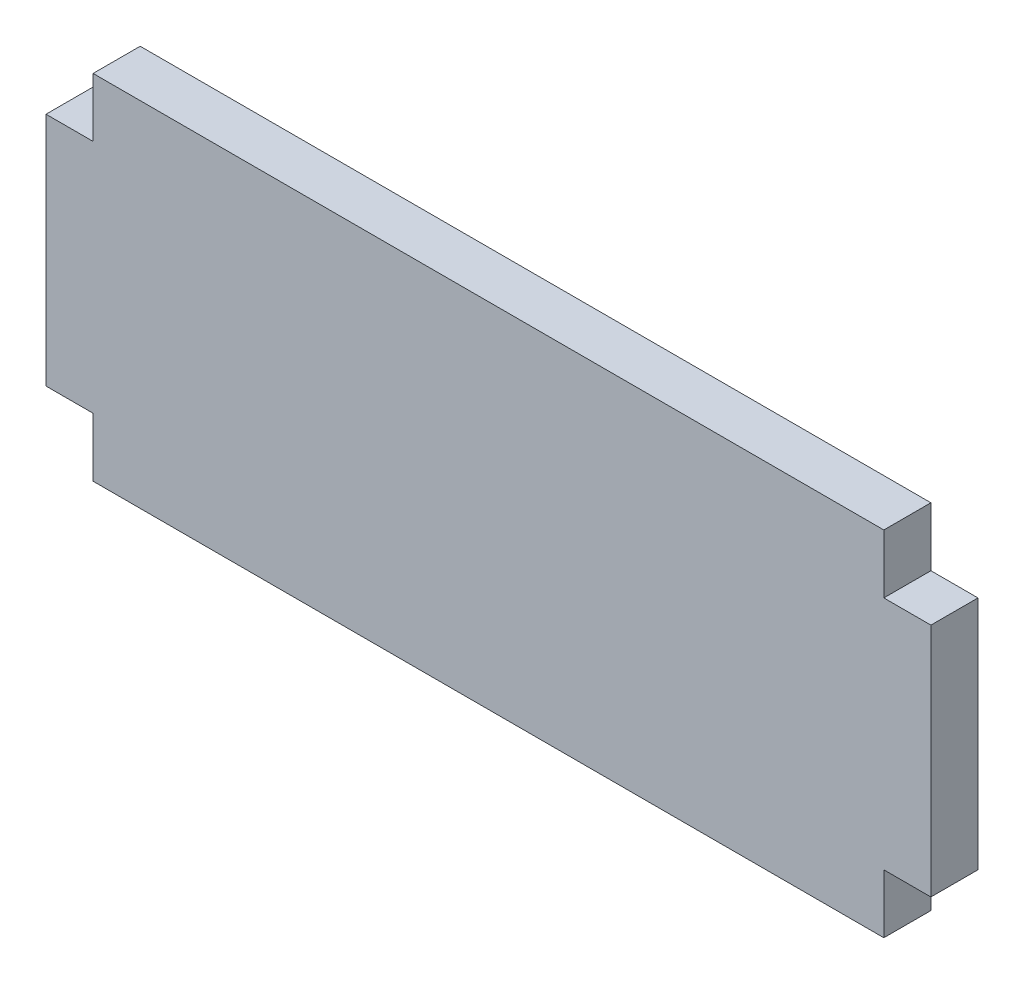
ISO-10303-21;
HEADER;
FILE_DESCRIPTION(('STEP AP214'),'2;1');
FILE_NAME('part.step','',(''),(''),'','','');
FILE_SCHEMA(('AUTOMOTIVE_DESIGN { 1 0 10303 214 1 1 1 1 }'));
ENDSEC;
DATA;
#1=APPLICATION_CONTEXT('core data for automotive mechanical design processes');
#2=APPLICATION_PROTOCOL_DEFINITION('international standard','automotive_design',2000,#1);
#3=PRODUCT_CONTEXT('',#1,'mechanical');
#4=PRODUCT('Part','Part','',(#3));
#5=PRODUCT_RELATED_PRODUCT_CATEGORY('part','',(#4));
#6=PRODUCT_DEFINITION_FORMATION('','',#4);
#7=PRODUCT_DEFINITION_CONTEXT('part definition',#1,'design');
#8=PRODUCT_DEFINITION('design','',#6,#7);
#9=PRODUCT_DEFINITION_SHAPE('','',#8);
#10=(LENGTH_UNIT() NAMED_UNIT(*) SI_UNIT(.MILLI.,.METRE.));
#11=(NAMED_UNIT(*) PLANE_ANGLE_UNIT() SI_UNIT($,.RADIAN.));
#12=(NAMED_UNIT(*) SI_UNIT($,.STERADIAN.) SOLID_ANGLE_UNIT());
#13=UNCERTAINTY_MEASURE_WITH_UNIT(LENGTH_MEASURE(1.E-05),#10,'distance_accuracy_value','');
#14=(GEOMETRIC_REPRESENTATION_CONTEXT(3) GLOBAL_UNCERTAINTY_ASSIGNED_CONTEXT((#13)) GLOBAL_UNIT_ASSIGNED_CONTEXT((#10,
#11,#12)) REPRESENTATION_CONTEXT('',''));
#15=CARTESIAN_POINT('',(0.,0.,0.));
#16=DIRECTION('',(0.,0.,1.));
#17=DIRECTION('',(1.,0.,0.));
#18=AXIS2_PLACEMENT_3D('',#15,#16,#17);
#19=CARTESIAN_POINT('',(0.,-6.,2.4));
#20=DIRECTION('',(0.,-1.,0.));
#21=DIRECTION('',(0.,0.,-1.));
#22=AXIS2_PLACEMENT_3D('',#19,#20,#21);
#23=PLANE('',#22);
#24=DIRECTION('',(-1.,0.,0.));
#25=VECTOR('',#24,1.);
#26=CARTESIAN_POINT('',(0.,-6.,0.));
#27=LINE('',#26,#25);
#28=CARTESIAN_POINT('',(-20.15,-6.,0.));
#29=VERTEX_POINT('',#28);
#30=CARTESIAN_POINT('',(-22.55,-6.,0.));
#31=VERTEX_POINT('',#30);
#32=EDGE_CURVE('E154',#29,#31,#27,.T.);
#33=ORIENTED_EDGE('',*,*,#32,.F.);
#34=DIRECTION('',(0.,0.,-1.));
#35=VECTOR('',#34,1.);
#36=CARTESIAN_POINT('',(-20.15,-6.,2.4));
#37=LINE('',#36,#35);
#38=CARTESIAN_POINT('',(-20.15,-6.,2.4));
#39=VERTEX_POINT('',#38);
#40=EDGE_CURVE('E11',#39,#29,#37,.T.);
#41=ORIENTED_EDGE('',*,*,#40,.F.);
#42=DIRECTION('',(-1.,0.,0.));
#43=VECTOR('',#42,1.);
#44=CARTESIAN_POINT('',(0.,-6.,2.4));
#45=LINE('',#44,#43);
#46=CARTESIAN_POINT('',(-22.55,-6.,2.4));
#47=VERTEX_POINT('',#46);
#48=EDGE_CURVE('E181',#39,#47,#45,.T.);
#49=ORIENTED_EDGE('',*,*,#48,.T.);
#50=DIRECTION('',(0.,0.,-1.));
#51=VECTOR('',#50,1.);
#52=CARTESIAN_POINT('',(-22.55,-6.,2.4));
#53=LINE('',#52,#51);
#54=EDGE_CURVE('E97',#47,#31,#53,.T.);
#55=ORIENTED_EDGE('',*,*,#54,.T.);
#56=EDGE_LOOP('',(#33,#41,#49,#55));
#57=FACE_BOUND('',#56,.T.);
#58=ADVANCED_FACE('F34',(#57),#23,.T.);
#59=CARTESIAN_POINT('',(-20.15,0.,2.4));
#60=DIRECTION('',(1.,0.,0.));
#61=DIRECTION('',(0.,1.,0.));
#62=AXIS2_PLACEMENT_3D('',#59,#60,#61);
#63=PLANE('',#62);
#64=DIRECTION('',(0.,-1.,0.));
#65=VECTOR('',#64,1.);
#66=CARTESIAN_POINT('',(-20.15,0.,0.));
#67=LINE('',#66,#65);
#68=CARTESIAN_POINT('',(-20.15,-8.99999999999999,0.));
#69=VERTEX_POINT('',#68);
#70=EDGE_CURVE('E157',#29,#69,#67,.T.);
#71=ORIENTED_EDGE('',*,*,#70,.T.);
#72=DIRECTION('',(0.,0.,-1.));
#73=VECTOR('',#72,1.);
#74=CARTESIAN_POINT('',(-20.15,-8.99999999999999,2.4));
#75=LINE('',#74,#73);
#76=CARTESIAN_POINT('',(-20.15,-8.99999999999999,2.4));
#77=VERTEX_POINT('',#76);
#78=EDGE_CURVE('E42',#77,#69,#75,.T.);
#79=ORIENTED_EDGE('',*,*,#78,.F.);
#80=DIRECTION('',(0.,-1.,0.));
#81=VECTOR('',#80,1.);
#82=CARTESIAN_POINT('',(-20.15,0.,2.4));
#83=LINE('',#82,#81);
#84=EDGE_CURVE('E140',#39,#77,#83,.T.);
#85=ORIENTED_EDGE('',*,*,#84,.F.);
#86=ORIENTED_EDGE('',*,*,#40,.T.);
#87=EDGE_LOOP('',(#71,#79,#85,#86));
#88=FACE_BOUND('',#87,.T.);
#89=ADVANCED_FACE('F205',(#88),#63,.F.);
#90=CARTESIAN_POINT('',(0.,-8.99999999999998,2.4));
#91=DIRECTION('',(0.,-1.,0.));
#92=DIRECTION('',(1.,0.,0.));
#93=AXIS2_PLACEMENT_3D('',#90,#91,#92);
#94=PLANE('',#93);
#95=DIRECTION('',(-1.,0.,0.));
#96=VECTOR('',#95,1.);
#97=CARTESIAN_POINT('',(0.,-8.99999999999998,0.));
#98=LINE('',#97,#96);
#99=CARTESIAN_POINT('',(20.15,-8.99999999999997,0.));
#100=VERTEX_POINT('',#99);
#101=EDGE_CURVE('E160',#100,#69,#98,.T.);
#102=ORIENTED_EDGE('',*,*,#101,.F.);
#103=DIRECTION('',(0.,0.,-1.));
#104=VECTOR('',#103,1.);
#105=CARTESIAN_POINT('',(20.15,-8.99999999999997,2.4));
#106=LINE('',#105,#104);
#107=CARTESIAN_POINT('',(20.15,-8.99999999999997,2.4));
#108=VERTEX_POINT('',#107);
#109=EDGE_CURVE('E195',#108,#100,#106,.T.);
#110=ORIENTED_EDGE('',*,*,#109,.F.);
#111=DIRECTION('',(-1.,0.,0.));
#112=VECTOR('',#111,1.);
#113=CARTESIAN_POINT('',(0.,-8.99999999999998,2.4));
#114=LINE('',#113,#112);
#115=EDGE_CURVE('E202',#108,#77,#114,.T.);
#116=ORIENTED_EDGE('',*,*,#115,.T.);
#117=ORIENTED_EDGE('',*,*,#78,.T.);
#118=EDGE_LOOP('',(#102,#110,#116,#117));
#119=FACE_BOUND('',#118,.T.);
#120=ADVANCED_FACE('F200',(#119),#94,.T.);
#121=CARTESIAN_POINT('',(20.15,0.,2.4));
#122=DIRECTION('',(1.,0.,0.));
#123=DIRECTION('',(0.,1.,0.));
#124=AXIS2_PLACEMENT_3D('',#121,#122,#123);
#125=PLANE('',#124);
#126=DIRECTION('',(0.,-1.,0.));
#127=VECTOR('',#126,1.);
#128=CARTESIAN_POINT('',(20.15,0.,0.));
#129=LINE('',#128,#127);
#130=CARTESIAN_POINT('',(20.15,-6.00000000000001,0.));
#131=VERTEX_POINT('',#130);
#132=EDGE_CURVE('E163',#131,#100,#129,.T.);
#133=ORIENTED_EDGE('',*,*,#132,.F.);
#134=DIRECTION('',(0.,0.,-1.));
#135=VECTOR('',#134,1.);
#136=CARTESIAN_POINT('',(20.15,-6.00000000000001,2.4));
#137=LINE('',#136,#135);
#138=CARTESIAN_POINT('',(20.15,-6.00000000000001,2.4));
#139=VERTEX_POINT('',#138);
#140=EDGE_CURVE('E193',#139,#131,#137,.T.);
#141=ORIENTED_EDGE('',*,*,#140,.F.);
#142=DIRECTION('',(0.,-1.,0.));
#143=VECTOR('',#142,1.);
#144=CARTESIAN_POINT('',(20.15,0.,2.4));
#145=LINE('',#144,#143);
#146=EDGE_CURVE('E215',#139,#108,#145,.T.);
#147=ORIENTED_EDGE('',*,*,#146,.T.);
#148=ORIENTED_EDGE('',*,*,#109,.T.);
#149=EDGE_LOOP('',(#133,#141,#147,#148));
#150=FACE_BOUND('',#149,.T.);
#151=ADVANCED_FACE('F211',(#150),#125,.T.);
#152=CARTESIAN_POINT('',(0.,-6.00000000000001,2.4));
#153=DIRECTION('',(0.,1.,0.));
#154=DIRECTION('',(0.,0.,1.));
#155=AXIS2_PLACEMENT_3D('',#152,#153,#154);
#156=PLANE('',#155);
#157=DIRECTION('',(1.,0.,0.));
#158=VECTOR('',#157,1.);
#159=CARTESIAN_POINT('',(0.,-6.00000000000001,0.));
#160=LINE('',#159,#158);
#161=CARTESIAN_POINT('',(22.55,-6.00000000000001,0.));
#162=VERTEX_POINT('',#161);
#163=EDGE_CURVE('E166',#131,#162,#160,.T.);
#164=ORIENTED_EDGE('',*,*,#163,.T.);
#165=DIRECTION('',(0.,0.,-1.));
#166=VECTOR('',#165,1.);
#167=CARTESIAN_POINT('',(22.55,-6.00000000000001,2.4));
#168=LINE('',#167,#166);
#169=CARTESIAN_POINT('',(22.55,-6.00000000000001,2.4));
#170=VERTEX_POINT('',#169);
#171=EDGE_CURVE('E191',#170,#162,#168,.T.);
#172=ORIENTED_EDGE('',*,*,#171,.F.);
#173=DIRECTION('',(1.,0.,0.));
#174=VECTOR('',#173,1.);
#175=CARTESIAN_POINT('',(0.,-6.00000000000001,2.4));
#176=LINE('',#175,#174);
#177=EDGE_CURVE('E217',#139,#170,#176,.T.);
#178=ORIENTED_EDGE('',*,*,#177,.F.);
#179=ORIENTED_EDGE('',*,*,#140,.T.);
#180=EDGE_LOOP('',(#164,#172,#178,#179));
#181=FACE_BOUND('',#180,.T.);
#182=ADVANCED_FACE('F321',(#181),#156,.F.);
#183=CARTESIAN_POINT('',(22.55,0.,2.4));
#184=DIRECTION('',(1.,0.,0.));
#185=DIRECTION('',(0.,0.,-1.));
#186=AXIS2_PLACEMENT_3D('',#183,#184,#185);
#187=PLANE('',#186);
#188=DIRECTION('',(0.,-1.,0.));
#189=VECTOR('',#188,1.);
#190=CARTESIAN_POINT('',(22.55,0.,0.));
#191=LINE('',#190,#189);
#192=CARTESIAN_POINT('',(22.55,6.00000000000001,0.));
#193=VERTEX_POINT('',#192);
#194=EDGE_CURVE('E170',#193,#162,#191,.T.);
#195=ORIENTED_EDGE('',*,*,#194,.F.);
#196=DIRECTION('',(0.,0.,-1.));
#197=VECTOR('',#196,1.);
#198=CARTESIAN_POINT('',(22.55,6.00000000000001,2.4));
#199=LINE('',#198,#197);
#200=CARTESIAN_POINT('',(22.55,6.00000000000001,2.4));
#201=VERTEX_POINT('',#200);
#202=EDGE_CURVE('E189',#201,#193,#199,.T.);
#203=ORIENTED_EDGE('',*,*,#202,.F.);
#204=DIRECTION('',(0.,-1.,0.));
#205=VECTOR('',#204,1.);
#206=CARTESIAN_POINT('',(22.55,0.,2.4));
#207=LINE('',#206,#205);
#208=EDGE_CURVE('E223',#201,#170,#207,.T.);
#209=ORIENTED_EDGE('',*,*,#208,.T.);
#210=ORIENTED_EDGE('',*,*,#171,.T.);
#211=EDGE_LOOP('',(#195,#203,#209,#210));
#212=FACE_BOUND('',#211,.T.);
#213=ADVANCED_FACE('F238',(#212),#187,.T.);
#214=CARTESIAN_POINT('',(0.,6.00000000000001,2.4));
#215=DIRECTION('',(0.,1.,0.));
#216=DIRECTION('',(0.,0.,1.));
#217=AXIS2_PLACEMENT_3D('',#214,#215,#216);
#218=PLANE('',#217);
#219=DIRECTION('',(1.,0.,0.));
#220=VECTOR('',#219,1.);
#221=CARTESIAN_POINT('',(0.,6.00000000000001,0.));
#222=LINE('',#221,#220);
#223=CARTESIAN_POINT('',(20.15,6.00000000000001,0.));
#224=VERTEX_POINT('',#223);
#225=EDGE_CURVE('E173',#224,#193,#222,.T.);
#226=ORIENTED_EDGE('',*,*,#225,.F.);
#227=DIRECTION('',(0.,0.,-1.));
#228=VECTOR('',#227,1.);
#229=CARTESIAN_POINT('',(20.15,6.00000000000001,2.4));
#230=LINE('',#229,#228);
#231=CARTESIAN_POINT('',(20.15,6.00000000000001,2.4));
#232=VERTEX_POINT('',#231);
#233=EDGE_CURVE('E187',#232,#224,#230,.T.);
#234=ORIENTED_EDGE('',*,*,#233,.F.);
#235=DIRECTION('',(1.,0.,0.));
#236=VECTOR('',#235,1.);
#237=CARTESIAN_POINT('',(0.,6.00000000000001,2.4));
#238=LINE('',#237,#236);
#239=EDGE_CURVE('E225',#232,#201,#238,.T.);
#240=ORIENTED_EDGE('',*,*,#239,.T.);
#241=ORIENTED_EDGE('',*,*,#202,.T.);
#242=EDGE_LOOP('',(#226,#234,#240,#241));
#243=FACE_BOUND('',#242,.T.);
#244=ADVANCED_FACE('F239',(#243),#218,.T.);
#245=CARTESIAN_POINT('',(20.15,8.99999999999999,0.));
#246=VERTEX_POINT('',#245);
#247=EDGE_CURVE('E167',#246,#224,#129,.T.);
#248=ORIENTED_EDGE('',*,*,#247,.F.);
#249=DIRECTION('',(0.,0.,-1.));
#250=VECTOR('',#249,1.);
#251=CARTESIAN_POINT('',(20.15,8.99999999999999,2.4));
#252=LINE('',#251,#250);
#253=CARTESIAN_POINT('',(20.15,8.99999999999999,2.4));
#254=VERTEX_POINT('',#253);
#255=EDGE_CURVE('E185',#254,#246,#252,.T.);
#256=ORIENTED_EDGE('',*,*,#255,.F.);
#257=EDGE_CURVE('E219',#254,#232,#145,.T.);
#258=ORIENTED_EDGE('',*,*,#257,.T.);
#259=ORIENTED_EDGE('',*,*,#233,.T.);
#260=EDGE_LOOP('',(#248,#256,#258,#259));
#261=FACE_BOUND('',#260,.T.);
#262=ADVANCED_FACE('F232',(#261),#125,.T.);
#263=CARTESIAN_POINT('',(0.,8.99999999999999,2.4));
#264=DIRECTION('',(0.,-1.,0.));
#265=DIRECTION('',(0.,0.,-1.));
#266=AXIS2_PLACEMENT_3D('',#263,#264,#265);
#267=PLANE('',#266);
#268=DIRECTION('',(-1.,0.,0.));
#269=VECTOR('',#268,1.);
#270=CARTESIAN_POINT('',(0.,8.99999999999999,0.));
#271=LINE('',#270,#269);
#272=CARTESIAN_POINT('',(-20.15,8.99999999999999,0.));
#273=VERTEX_POINT('',#272);
#274=EDGE_CURVE('E176',#246,#273,#271,.T.);
#275=ORIENTED_EDGE('',*,*,#274,.T.);
#276=DIRECTION('',(0.,0.,-1.));
#277=VECTOR('',#276,1.);
#278=CARTESIAN_POINT('',(-20.15,8.99999999999999,2.4));
#279=LINE('',#278,#277);
#280=CARTESIAN_POINT('',(-20.15,8.99999999999999,2.4));
#281=VERTEX_POINT('',#280);
#282=EDGE_CURVE('E145',#281,#273,#279,.T.);
#283=ORIENTED_EDGE('',*,*,#282,.F.);
#284=DIRECTION('',(-1.,0.,0.));
#285=VECTOR('',#284,1.);
#286=CARTESIAN_POINT('',(0.,8.99999999999999,2.4));
#287=LINE('',#286,#285);
#288=EDGE_CURVE('E135',#254,#281,#287,.T.);
#289=ORIENTED_EDGE('',*,*,#288,.F.);
#290=ORIENTED_EDGE('',*,*,#255,.T.);
#291=EDGE_LOOP('',(#275,#283,#289,#290));
#292=FACE_BOUND('',#291,.T.);
#293=ADVANCED_FACE('F243',(#292),#267,.F.);
#294=CARTESIAN_POINT('',(-20.15,6.,0.));
#295=VERTEX_POINT('',#294);
#296=EDGE_CURVE('E144',#273,#295,#67,.T.);
#297=ORIENTED_EDGE('',*,*,#296,.T.);
#298=DIRECTION('',(0.,0.,-1.));
#299=VECTOR('',#298,1.);
#300=CARTESIAN_POINT('',(-20.15,6.,2.4));
#301=LINE('',#300,#299);
#302=CARTESIAN_POINT('',(-20.15,6.,2.4));
#303=VERTEX_POINT('',#302);
#304=EDGE_CURVE('E141',#303,#295,#301,.T.);
#305=ORIENTED_EDGE('',*,*,#304,.F.);
#306=EDGE_CURVE('E128',#281,#303,#83,.T.);
#307=ORIENTED_EDGE('',*,*,#306,.F.);
#308=ORIENTED_EDGE('',*,*,#282,.T.);
#309=EDGE_LOOP('',(#297,#305,#307,#308));
#310=FACE_BOUND('',#309,.T.);
#311=ADVANCED_FACE('F142',(#310),#63,.F.);
#312=CARTESIAN_POINT('',(0.,6.,2.4));
#313=DIRECTION('',(0.,-1.,0.));
#314=DIRECTION('',(0.,0.,-1.));
#315=AXIS2_PLACEMENT_3D('',#312,#313,#314);
#316=PLANE('',#315);
#317=DIRECTION('',(-1.,0.,0.));
#318=VECTOR('',#317,1.);
#319=CARTESIAN_POINT('',(0.,6.,0.));
#320=LINE('',#319,#318);
#321=CARTESIAN_POINT('',(-22.55,6.,0.));
#322=VERTEX_POINT('',#321);
#323=EDGE_CURVE('E90',#295,#322,#320,.T.);
#324=ORIENTED_EDGE('',*,*,#323,.T.);
#325=DIRECTION('',(0.,0.,-1.));
#326=VECTOR('',#325,1.);
#327=CARTESIAN_POINT('',(-22.55,6.,2.4));
#328=LINE('',#327,#326);
#329=CARTESIAN_POINT('',(-22.55,6.,2.4));
#330=VERTEX_POINT('',#329);
#331=EDGE_CURVE('E146',#330,#322,#328,.T.);
#332=ORIENTED_EDGE('',*,*,#331,.F.);
#333=DIRECTION('',(-1.,0.,0.));
#334=VECTOR('',#333,1.);
#335=CARTESIAN_POINT('',(0.,6.,2.4));
#336=LINE('',#335,#334);
#337=EDGE_CURVE('E132',#303,#330,#336,.T.);
#338=ORIENTED_EDGE('',*,*,#337,.F.);
#339=ORIENTED_EDGE('',*,*,#304,.T.);
#340=EDGE_LOOP('',(#324,#332,#338,#339));
#341=FACE_BOUND('',#340,.T.);
#342=ADVANCED_FACE('F148',(#341),#316,.F.);
#343=CARTESIAN_POINT('',(-22.55,0.,2.4));
#344=DIRECTION('',(1.,0.,0.));
#345=DIRECTION('',(0.,0.,-1.));
#346=AXIS2_PLACEMENT_3D('',#343,#344,#345);
#347=PLANE('',#346);
#348=DIRECTION('',(0.,-1.,0.));
#349=VECTOR('',#348,1.);
#350=CARTESIAN_POINT('',(-22.55,0.,0.));
#351=LINE('',#350,#349);
#352=EDGE_CURVE('E179',#322,#31,#351,.T.);
#353=ORIENTED_EDGE('',*,*,#352,.T.);
#354=ORIENTED_EDGE('',*,*,#54,.F.);
#355=DIRECTION('',(0.,-1.,0.));
#356=VECTOR('',#355,1.);
#357=CARTESIAN_POINT('',(-22.55,0.,2.4));
#358=LINE('',#357,#356);
#359=EDGE_CURVE('E50',#330,#47,#358,.T.);
#360=ORIENTED_EDGE('',*,*,#359,.F.);
#361=ORIENTED_EDGE('',*,*,#331,.T.);
#362=EDGE_LOOP('',(#353,#354,#360,#361));
#363=FACE_BOUND('',#362,.T.);
#364=ADVANCED_FACE('F258',(#363),#347,.F.);
#365=CARTESIAN_POINT('',(0.,0.,2.4));
#366=DIRECTION('',(0.,0.,1.));
#367=DIRECTION('',(1.,0.,0.));
#368=AXIS2_PLACEMENT_3D('',#365,#366,#367);
#369=PLANE('',#368);
#370=ORIENTED_EDGE('',*,*,#48,.F.);
#371=ORIENTED_EDGE('',*,*,#84,.T.);
#372=ORIENTED_EDGE('',*,*,#115,.F.);
#373=ORIENTED_EDGE('',*,*,#146,.F.);
#374=ORIENTED_EDGE('',*,*,#177,.T.);
#375=ORIENTED_EDGE('',*,*,#208,.F.);
#376=ORIENTED_EDGE('',*,*,#239,.F.);
#377=ORIENTED_EDGE('',*,*,#257,.F.);
#378=ORIENTED_EDGE('',*,*,#288,.T.);
#379=ORIENTED_EDGE('',*,*,#306,.T.);
#380=ORIENTED_EDGE('',*,*,#337,.T.);
#381=ORIENTED_EDGE('',*,*,#359,.T.);
#382=EDGE_LOOP('',(#370,#371,#372,#373,#374,#375,#376,#377,#378,#379,#380,#381));
#383=FACE_BOUND('',#382,.T.);
#384=ADVANCED_FACE('F130',(#383),#369,.T.);
#385=CARTESIAN_POINT('',(0.,0.,0.));
#386=DIRECTION('',(0.,0.,1.));
#387=DIRECTION('',(1.,0.,0.));
#388=AXIS2_PLACEMENT_3D('',#385,#386,#387);
#389=PLANE('',#388);
#390=ORIENTED_EDGE('',*,*,#32,.T.);
#391=ORIENTED_EDGE('',*,*,#352,.F.);
#392=ORIENTED_EDGE('',*,*,#323,.F.);
#393=ORIENTED_EDGE('',*,*,#296,.F.);
#394=ORIENTED_EDGE('',*,*,#274,.F.);
#395=ORIENTED_EDGE('',*,*,#247,.T.);
#396=ORIENTED_EDGE('',*,*,#225,.T.);
#397=ORIENTED_EDGE('',*,*,#194,.T.);
#398=ORIENTED_EDGE('',*,*,#163,.F.);
#399=ORIENTED_EDGE('',*,*,#132,.T.);
#400=ORIENTED_EDGE('',*,*,#101,.T.);
#401=ORIENTED_EDGE('',*,*,#70,.F.);
#402=EDGE_LOOP('',(#390,#391,#392,#393,#394,#395,#396,#397,#398,#399,#400,#401));
#403=FACE_BOUND('',#402,.T.);
#404=ADVANCED_FACE('F207',(#403),#389,.F.);
#405=CLOSED_SHELL('',(#58,#89,#120,#151,#182,#213,#244,#262,#293,#311,#342,#364,#384,#404));
#406=MANIFOLD_SOLID_BREP('B2',#405);
#407=ADVANCED_BREP_SHAPE_REPRESENTATION('',(#18,#406),#14);
#408=SHAPE_DEFINITION_REPRESENTATION(#9,#407);
ENDSEC;
END-ISO-10303-21;
